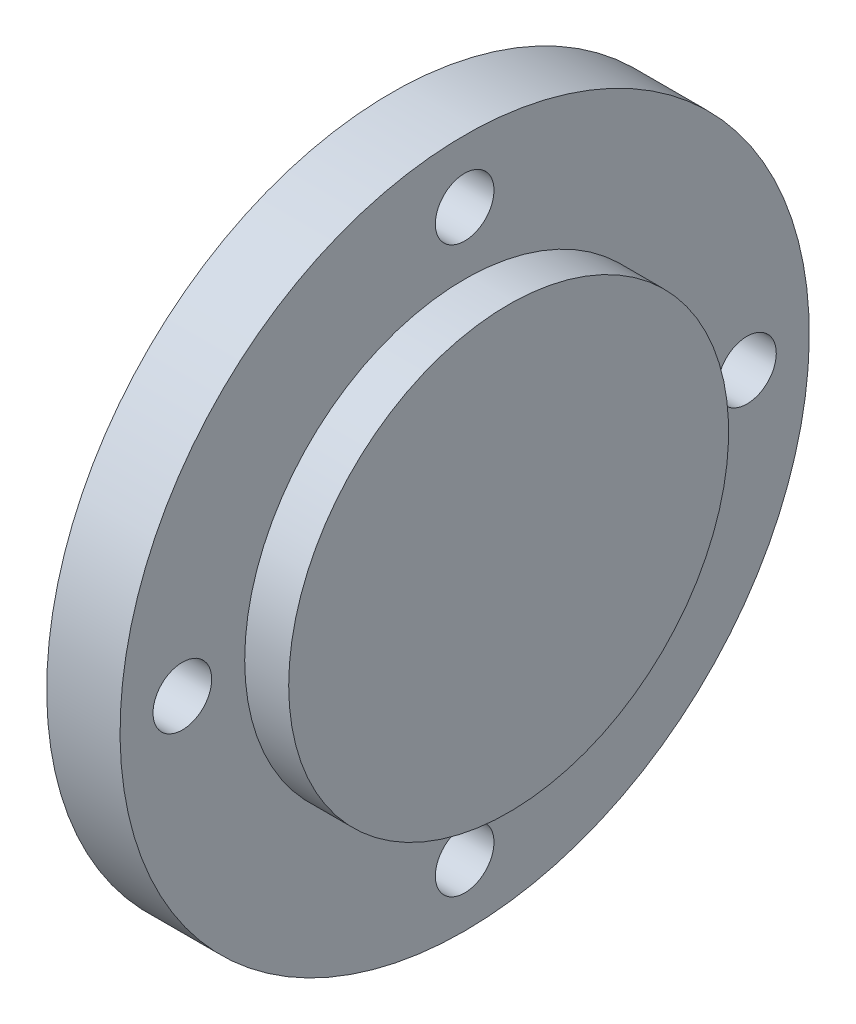
ISO-10303-21;
HEADER;
FILE_DESCRIPTION(('STEP AP214'),'2;1');
FILE_NAME('part.step','',(''),(''),'','','');
FILE_SCHEMA(('AUTOMOTIVE_DESIGN { 1 0 10303 214 1 1 1 1 }'));
ENDSEC;
DATA;
#1=APPLICATION_CONTEXT('core data for automotive mechanical design processes');
#2=APPLICATION_PROTOCOL_DEFINITION('international standard','automotive_design',2000,#1);
#3=PRODUCT_CONTEXT('',#1,'mechanical');
#4=PRODUCT('Part','Part','',(#3));
#5=PRODUCT_RELATED_PRODUCT_CATEGORY('part','',(#4));
#6=PRODUCT_DEFINITION_FORMATION('','',#4);
#7=PRODUCT_DEFINITION_CONTEXT('part definition',#1,'design');
#8=PRODUCT_DEFINITION('design','',#6,#7);
#9=PRODUCT_DEFINITION_SHAPE('','',#8);
#10=(LENGTH_UNIT() NAMED_UNIT(*) SI_UNIT(.MILLI.,.METRE.));
#11=(NAMED_UNIT(*) PLANE_ANGLE_UNIT() SI_UNIT($,.RADIAN.));
#12=(NAMED_UNIT(*) SI_UNIT($,.STERADIAN.) SOLID_ANGLE_UNIT());
#13=UNCERTAINTY_MEASURE_WITH_UNIT(LENGTH_MEASURE(1.E-05),#10,'distance_accuracy_value','');
#14=(GEOMETRIC_REPRESENTATION_CONTEXT(3) GLOBAL_UNCERTAINTY_ASSIGNED_CONTEXT((#13)) GLOBAL_UNIT_ASSIGNED_CONTEXT((#10,
#11,#12)) REPRESENTATION_CONTEXT('',''));
#15=CARTESIAN_POINT('',(0.,0.,0.));
#16=DIRECTION('',(0.,0.,1.));
#17=DIRECTION('',(1.,0.,0.));
#18=AXIS2_PLACEMENT_3D('',#15,#16,#17);
#19=CARTESIAN_POINT('',(-1.,0.,0.));
#20=DIRECTION('',(1.,0.,0.));
#21=DIRECTION('',(0.,1.,0.));
#22=AXIS2_PLACEMENT_3D('',#19,#20,#21);
#23=PLANE('',#22);
#24=CARTESIAN_POINT('',(-1.,0.,0.));
#25=DIRECTION('',(1.,0.,0.));
#26=DIRECTION('',(0.,-1.,0.));
#27=AXIS2_PLACEMENT_3D('',#24,#25,#26);
#28=CIRCLE('',#27,7.55);
#29=CARTESIAN_POINT('',(-1.,7.55,0.));
#30=VERTEX_POINT('',#29);
#31=EDGE_CURVE('E180',#30,#30,#28,.T.);
#32=ORIENTED_EDGE('',*,*,#31,.T.);
#33=EDGE_LOOP('',(#32));
#34=FACE_BOUND('',#33,.T.);
#35=CARTESIAN_POINT('',(-1.,0.,0.));
#36=DIRECTION('',(-1.,0.,0.));
#37=DIRECTION('',(0.,0.,-1.));
#38=AXIS2_PLACEMENT_3D('',#35,#36,#37);
#39=CIRCLE('',#38,14.);
#40=CARTESIAN_POINT('',(-1.,0.,14.));
#41=VERTEX_POINT('',#40);
#42=EDGE_CURVE('E181',#41,#41,#39,.T.);
#43=ORIENTED_EDGE('',*,*,#42,.T.);
#44=EDGE_LOOP('',(#43));
#45=FACE_BOUND('',#44,.T.);
#46=ADVANCED_FACE('F17',(#34,#45),#23,.F.);
#47=CARTESIAN_POINT('',(0.,0.,0.));
#48=DIRECTION('',(1.,0.,0.));
#49=DIRECTION('',(0.,1.,0.));
#50=AXIS2_PLACEMENT_3D('',#47,#48,#49);
#51=PLANE('',#50);
#52=CARTESIAN_POINT('',(0.,0.,0.));
#53=DIRECTION('',(-1.,0.,0.));
#54=DIRECTION('',(0.,-1.,0.));
#55=AXIS2_PLACEMENT_3D('',#52,#53,#54);
#56=CIRCLE('',#55,7.55);
#57=CARTESIAN_POINT('',(0.,7.55,0.));
#58=VERTEX_POINT('',#57);
#59=EDGE_CURVE('E40',#58,#58,#56,.T.);
#60=ORIENTED_EDGE('',*,*,#59,.T.);
#61=EDGE_LOOP('',(#60));
#62=FACE_BOUND('',#61,.T.);
#63=CARTESIAN_POINT('',(0.,0.,0.));
#64=DIRECTION('',(1.,0.,0.));
#65=DIRECTION('',(0.,-1.,0.));
#66=AXIS2_PLACEMENT_3D('',#63,#64,#65);
#67=CIRCLE('',#66,10.5);
#68=CARTESIAN_POINT('',(0.,10.5,0.));
#69=VERTEX_POINT('',#68);
#70=EDGE_CURVE('E171',#69,#69,#67,.T.);
#71=ORIENTED_EDGE('',*,*,#70,.T.);
#72=EDGE_LOOP('',(#71));
#73=FACE_BOUND('',#72,.T.);
#74=ADVANCED_FACE('F270',(#62,#73),#51,.T.);
#75=CARTESIAN_POINT('',(0.,0.,0.));
#76=DIRECTION('',(-1.,0.,0.));
#77=DIRECTION('',(0.,1.,0.));
#78=AXIS2_PLACEMENT_3D('',#75,#76,#77);
#79=CYLINDRICAL_SURFACE('',#78,23.5);
#80=CARTESIAN_POINT('',(-2.,0.,0.));
#81=DIRECTION('',(-1.,0.,0.));
#82=DIRECTION('',(0.,0.,1.));
#83=AXIS2_PLACEMENT_3D('',#80,#81,#82);
#84=CIRCLE('',#83,23.5);
#85=CARTESIAN_POINT('',(-2.,-23.5,0.));
#86=VERTEX_POINT('',#85);
#87=EDGE_CURVE('E154',#86,#86,#84,.T.);
#88=ORIENTED_EDGE('',*,*,#87,.F.);
#89=DIRECTION('',(1.,0.,0.));
#90=VECTOR('',#89,1.);
#91=CARTESIAN_POINT('',(0.,-23.5,0.));
#92=LINE('',#91,#90);
#93=CARTESIAN_POINT('',(3.,-23.5,0.));
#94=VERTEX_POINT('',#93);
#95=EDGE_CURVE('E11',#86,#94,#92,.T.);
#96=ORIENTED_EDGE('',*,*,#95,.T.);
#97=CARTESIAN_POINT('',(3.,0.,0.));
#98=DIRECTION('',(1.,0.,0.));
#99=DIRECTION('',(0.,1.,0.));
#100=AXIS2_PLACEMENT_3D('',#97,#98,#99);
#101=CIRCLE('',#100,23.5);
#102=EDGE_CURVE('E163',#94,#94,#101,.T.);
#103=ORIENTED_EDGE('',*,*,#102,.F.);
#104=ORIENTED_EDGE('',*,*,#95,.F.);
#105=EDGE_LOOP('',(#88,#96,#103,#104));
#106=FACE_BOUND('',#105,.T.);
#107=ADVANCED_FACE('F251',(#106),#79,.T.);
#108=CARTESIAN_POINT('',(0.,0.,-19.25));
#109=DIRECTION('',(-1.,0.,0.));
#110=DIRECTION('',(0.,-1.,0.));
#111=AXIS2_PLACEMENT_3D('',#108,#109,#110);
#112=CYLINDRICAL_SURFACE('',#111,2.);
#113=CARTESIAN_POINT('',(-2.,0.,-19.25));
#114=DIRECTION('',(1.,0.,0.));
#115=DIRECTION('',(0.,0.,1.));
#116=AXIS2_PLACEMENT_3D('',#113,#114,#115);
#117=CIRCLE('',#116,2.);
#118=CARTESIAN_POINT('',(-2.,2.,-19.25));
#119=VERTEX_POINT('',#118);
#120=EDGE_CURVE('E143',#119,#119,#117,.T.);
#121=ORIENTED_EDGE('',*,*,#120,.F.);
#122=DIRECTION('',(1.,0.,0.));
#123=VECTOR('',#122,1.);
#124=CARTESIAN_POINT('',(0.,2.,-19.25));
#125=LINE('',#124,#123);
#126=CARTESIAN_POINT('',(3.,2.,-19.25));
#127=VERTEX_POINT('',#126);
#128=EDGE_CURVE('E28',#119,#127,#125,.T.);
#129=ORIENTED_EDGE('',*,*,#128,.T.);
#130=CARTESIAN_POINT('',(3.,0.,-19.25));
#131=DIRECTION('',(-1.,0.,0.));
#132=DIRECTION('',(0.,-1.,0.));
#133=AXIS2_PLACEMENT_3D('',#130,#131,#132);
#134=CIRCLE('',#133,2.);
#135=EDGE_CURVE('E158',#127,#127,#134,.T.);
#136=ORIENTED_EDGE('',*,*,#135,.F.);
#137=ORIENTED_EDGE('',*,*,#128,.F.);
#138=EDGE_LOOP('',(#121,#129,#136,#137));
#139=FACE_BOUND('',#138,.T.);
#140=ADVANCED_FACE('F19',(#139),#112,.F.);
#141=CARTESIAN_POINT('',(0.,19.25,0.));
#142=DIRECTION('',(-1.,0.,0.));
#143=DIRECTION('',(0.,-1.,0.));
#144=AXIS2_PLACEMENT_3D('',#141,#142,#143);
#145=CYLINDRICAL_SURFACE('',#144,2.);
#146=CARTESIAN_POINT('',(-2.,19.25,0.));
#147=DIRECTION('',(1.,0.,0.));
#148=DIRECTION('',(0.,0.,1.));
#149=AXIS2_PLACEMENT_3D('',#146,#147,#148);
#150=CIRCLE('',#149,2.);
#151=CARTESIAN_POINT('',(-2.,21.25,0.));
#152=VERTEX_POINT('',#151);
#153=EDGE_CURVE('E151',#152,#152,#150,.T.);
#154=ORIENTED_EDGE('',*,*,#153,.F.);
#155=DIRECTION('',(1.,0.,0.));
#156=VECTOR('',#155,1.);
#157=CARTESIAN_POINT('',(0.,21.25,0.));
#158=LINE('',#157,#156);
#159=CARTESIAN_POINT('',(3.,21.25,0.));
#160=VERTEX_POINT('',#159);
#161=EDGE_CURVE('E136',#152,#160,#158,.T.);
#162=ORIENTED_EDGE('',*,*,#161,.T.);
#163=CARTESIAN_POINT('',(3.,19.25,0.));
#164=DIRECTION('',(-1.,0.,0.));
#165=DIRECTION('',(0.,-1.,0.));
#166=AXIS2_PLACEMENT_3D('',#163,#164,#165);
#167=CIRCLE('',#166,2.);
#168=EDGE_CURVE('E162',#160,#160,#167,.T.);
#169=ORIENTED_EDGE('',*,*,#168,.F.);
#170=ORIENTED_EDGE('',*,*,#161,.F.);
#171=EDGE_LOOP('',(#154,#162,#169,#170));
#172=FACE_BOUND('',#171,.T.);
#173=ADVANCED_FACE('F281',(#172),#145,.F.);
#174=CARTESIAN_POINT('',(0.,0.,19.25));
#175=DIRECTION('',(-1.,0.,0.));
#176=DIRECTION('',(0.,-1.,0.));
#177=AXIS2_PLACEMENT_3D('',#174,#175,#176);
#178=CYLINDRICAL_SURFACE('',#177,2.);
#179=CARTESIAN_POINT('',(-2.,0.,19.25));
#180=DIRECTION('',(1.,0.,0.));
#181=DIRECTION('',(0.,0.,1.));
#182=AXIS2_PLACEMENT_3D('',#179,#180,#181);
#183=CIRCLE('',#182,2.);
#184=CARTESIAN_POINT('',(-2.,2.,19.25));
#185=VERTEX_POINT('',#184);
#186=EDGE_CURVE('E132',#185,#185,#183,.T.);
#187=ORIENTED_EDGE('',*,*,#186,.F.);
#188=DIRECTION('',(1.,0.,0.));
#189=VECTOR('',#188,1.);
#190=CARTESIAN_POINT('',(0.,2.,19.25));
#191=LINE('',#190,#189);
#192=CARTESIAN_POINT('',(3.,2.,19.25));
#193=VERTEX_POINT('',#192);
#194=EDGE_CURVE('E129',#185,#193,#191,.T.);
#195=ORIENTED_EDGE('',*,*,#194,.T.);
#196=CARTESIAN_POINT('',(3.,0.,19.25));
#197=DIRECTION('',(-1.,0.,0.));
#198=DIRECTION('',(0.,-1.,0.));
#199=AXIS2_PLACEMENT_3D('',#196,#197,#198);
#200=CIRCLE('',#199,2.);
#201=EDGE_CURVE('E134',#193,#193,#200,.T.);
#202=ORIENTED_EDGE('',*,*,#201,.F.);
#203=ORIENTED_EDGE('',*,*,#194,.F.);
#204=EDGE_LOOP('',(#187,#195,#202,#203));
#205=FACE_BOUND('',#204,.T.);
#206=ADVANCED_FACE('F131',(#205),#178,.F.);
#207=CARTESIAN_POINT('',(0.,-19.25,0.));
#208=DIRECTION('',(-1.,0.,0.));
#209=DIRECTION('',(0.,-1.,0.));
#210=AXIS2_PLACEMENT_3D('',#207,#208,#209);
#211=CYLINDRICAL_SURFACE('',#210,2.);
#212=CARTESIAN_POINT('',(-2.,-19.25,0.));
#213=DIRECTION('',(1.,0.,0.));
#214=DIRECTION('',(0.,0.,1.));
#215=AXIS2_PLACEMENT_3D('',#212,#213,#214);
#216=CIRCLE('',#215,2.);
#217=CARTESIAN_POINT('',(-2.,-17.25,0.));
#218=VERTEX_POINT('',#217);
#219=EDGE_CURVE('E144',#218,#218,#216,.T.);
#220=ORIENTED_EDGE('',*,*,#219,.F.);
#221=DIRECTION('',(1.,0.,0.));
#222=VECTOR('',#221,1.);
#223=CARTESIAN_POINT('',(0.,-17.25,0.));
#224=LINE('',#223,#222);
#225=CARTESIAN_POINT('',(3.,-17.25,0.));
#226=VERTEX_POINT('',#225);
#227=EDGE_CURVE('E137',#218,#226,#224,.T.);
#228=ORIENTED_EDGE('',*,*,#227,.T.);
#229=CARTESIAN_POINT('',(3.,-19.25,0.));
#230=DIRECTION('',(-1.,0.,0.));
#231=DIRECTION('',(0.,-1.,0.));
#232=AXIS2_PLACEMENT_3D('',#229,#230,#231);
#233=CIRCLE('',#232,2.);
#234=EDGE_CURVE('E174',#226,#226,#233,.T.);
#235=ORIENTED_EDGE('',*,*,#234,.F.);
#236=ORIENTED_EDGE('',*,*,#227,.F.);
#237=EDGE_LOOP('',(#220,#228,#235,#236));
#238=FACE_BOUND('',#237,.T.);
#239=ADVANCED_FACE('F234',(#238),#211,.F.);
#240=CARTESIAN_POINT('',(0.,0.,0.));
#241=DIRECTION('',(-1.,0.,0.));
#242=DIRECTION('',(0.,-1.,0.));
#243=AXIS2_PLACEMENT_3D('',#240,#241,#242);
#244=CYLINDRICAL_SURFACE('',#243,7.55);
#245=ORIENTED_EDGE('',*,*,#31,.F.);
#246=DIRECTION('',(1.,0.,0.));
#247=VECTOR('',#246,1.);
#248=CARTESIAN_POINT('',(0.,7.55,0.));
#249=LINE('',#248,#247);
#250=EDGE_CURVE('E196',#30,#58,#249,.T.);
#251=ORIENTED_EDGE('',*,*,#250,.T.);
#252=ORIENTED_EDGE('',*,*,#59,.F.);
#253=ORIENTED_EDGE('',*,*,#250,.F.);
#254=EDGE_LOOP('',(#245,#251,#252,#253));
#255=FACE_BOUND('',#254,.T.);
#256=ADVANCED_FACE('F240',(#255),#244,.F.);
#257=CARTESIAN_POINT('',(3.,0.,0.));
#258=DIRECTION('',(1.,0.,0.));
#259=DIRECTION('',(0.,1.,0.));
#260=AXIS2_PLACEMENT_3D('',#257,#258,#259);
#261=PLANE('',#260);
#262=ORIENTED_EDGE('',*,*,#234,.T.);
#263=EDGE_LOOP('',(#262));
#264=FACE_BOUND('',#263,.T.);
#265=ORIENTED_EDGE('',*,*,#201,.T.);
#266=EDGE_LOOP('',(#265));
#267=FACE_BOUND('',#266,.T.);
#268=ORIENTED_EDGE('',*,*,#168,.T.);
#269=EDGE_LOOP('',(#268));
#270=FACE_BOUND('',#269,.T.);
#271=ORIENTED_EDGE('',*,*,#135,.T.);
#272=EDGE_LOOP('',(#271));
#273=FACE_BOUND('',#272,.T.);
#274=CARTESIAN_POINT('',(3.,0.,0.));
#275=DIRECTION('',(-1.,0.,0.));
#276=DIRECTION('',(0.,0.,-1.));
#277=AXIS2_PLACEMENT_3D('',#274,#275,#276);
#278=CIRCLE('',#277,15.);
#279=CARTESIAN_POINT('',(3.,0.,15.));
#280=VERTEX_POINT('',#279);
#281=EDGE_CURVE('E204',#280,#280,#278,.T.);
#282=ORIENTED_EDGE('',*,*,#281,.T.);
#283=EDGE_LOOP('',(#282));
#284=FACE_BOUND('',#283,.T.);
#285=ORIENTED_EDGE('',*,*,#102,.T.);
#286=EDGE_LOOP('',(#285));
#287=FACE_BOUND('',#286,.T.);
#288=ADVANCED_FACE('F236',(#264,#267,#270,#273,#284,#287),#261,.T.);
#289=CARTESIAN_POINT('',(0.,0.,0.));
#290=DIRECTION('',(1.,0.,0.));
#291=DIRECTION('',(0.,-1.,0.));
#292=AXIS2_PLACEMENT_3D('',#289,#290,#291);
#293=CYLINDRICAL_SURFACE('',#292,10.5);
#294=CARTESIAN_POINT('',(3.,0.,0.));
#295=DIRECTION('',(-1.,0.,0.));
#296=DIRECTION('',(0.,-1.,0.));
#297=AXIS2_PLACEMENT_3D('',#294,#295,#296);
#298=CIRCLE('',#297,10.5);
#299=CARTESIAN_POINT('',(3.,10.5,0.));
#300=VERTEX_POINT('',#299);
#301=EDGE_CURVE('E164',#300,#300,#298,.T.);
#302=ORIENTED_EDGE('',*,*,#301,.F.);
#303=DIRECTION('',(-1.,0.,0.));
#304=VECTOR('',#303,1.);
#305=CARTESIAN_POINT('',(0.,10.5,0.));
#306=LINE('',#305,#304);
#307=EDGE_CURVE('E106',#300,#69,#306,.T.);
#308=ORIENTED_EDGE('',*,*,#307,.T.);
#309=ORIENTED_EDGE('',*,*,#70,.F.);
#310=ORIENTED_EDGE('',*,*,#307,.F.);
#311=EDGE_LOOP('',(#302,#308,#309,#310));
#312=FACE_BOUND('',#311,.T.);
#313=ADVANCED_FACE('F239',(#312),#293,.F.);
#314=CARTESIAN_POINT('',(-2.,0.,0.));
#315=DIRECTION('',(-1.,0.,0.));
#316=DIRECTION('',(0.,0.,1.));
#317=AXIS2_PLACEMENT_3D('',#314,#315,#316);
#318=PLANE('',#317);
#319=CARTESIAN_POINT('',(-2.,0.,0.));
#320=DIRECTION('',(1.,0.,0.));
#321=DIRECTION('',(0.,0.,1.));
#322=AXIS2_PLACEMENT_3D('',#319,#320,#321);
#323=CIRCLE('',#322,16.);
#324=CARTESIAN_POINT('',(-2.,0.,-16.));
#325=VERTEX_POINT('',#324);
#326=EDGE_CURVE('E191',#325,#325,#323,.T.);
#327=ORIENTED_EDGE('',*,*,#326,.T.);
#328=EDGE_LOOP('',(#327));
#329=FACE_BOUND('',#328,.T.);
#330=ORIENTED_EDGE('',*,*,#153,.T.);
#331=EDGE_LOOP('',(#330));
#332=FACE_BOUND('',#331,.T.);
#333=ORIENTED_EDGE('',*,*,#120,.T.);
#334=EDGE_LOOP('',(#333));
#335=FACE_BOUND('',#334,.T.);
#336=ORIENTED_EDGE('',*,*,#186,.T.);
#337=EDGE_LOOP('',(#336));
#338=FACE_BOUND('',#337,.T.);
#339=ORIENTED_EDGE('',*,*,#219,.T.);
#340=EDGE_LOOP('',(#339));
#341=FACE_BOUND('',#340,.T.);
#342=ORIENTED_EDGE('',*,*,#87,.T.);
#343=EDGE_LOOP('',(#342));
#344=FACE_BOUND('',#343,.T.);
#345=ADVANCED_FACE('F140',(#329,#332,#335,#338,#341,#344),#318,.T.);
#346=CARTESIAN_POINT('',(-1.,0.,0.));
#347=DIRECTION('',(-1.,0.,0.));
#348=DIRECTION('',(0.,0.,-1.));
#349=AXIS2_PLACEMENT_3D('',#346,#347,#348);
#350=CYLINDRICAL_SURFACE('',#349,14.);
#351=CARTESIAN_POINT('',(-3.,0.,0.));
#352=DIRECTION('',(1.,0.,0.));
#353=DIRECTION('',(0.,0.,-1.));
#354=AXIS2_PLACEMENT_3D('',#351,#352,#353);
#355=CIRCLE('',#354,14.);
#356=CARTESIAN_POINT('',(-3.,0.,14.));
#357=VERTEX_POINT('',#356);
#358=EDGE_CURVE('E21',#357,#357,#355,.T.);
#359=ORIENTED_EDGE('',*,*,#358,.F.);
#360=DIRECTION('',(1.,0.,0.));
#361=VECTOR('',#360,1.);
#362=CARTESIAN_POINT('',(-1.,0.,14.));
#363=LINE('',#362,#361);
#364=EDGE_CURVE('E184',#357,#41,#363,.T.);
#365=ORIENTED_EDGE('',*,*,#364,.T.);
#366=ORIENTED_EDGE('',*,*,#42,.F.);
#367=ORIENTED_EDGE('',*,*,#364,.F.);
#368=EDGE_LOOP('',(#359,#365,#366,#367));
#369=FACE_BOUND('',#368,.T.);
#370=ADVANCED_FACE('F254',(#369),#350,.F.);
#371=CARTESIAN_POINT('',(-3.,0.,0.));
#372=DIRECTION('',(-1.,0.,0.));
#373=DIRECTION('',(0.,0.,1.));
#374=AXIS2_PLACEMENT_3D('',#371,#372,#373);
#375=PLANE('',#374);
#376=ORIENTED_EDGE('',*,*,#358,.T.);
#377=EDGE_LOOP('',(#376));
#378=FACE_BOUND('',#377,.T.);
#379=CARTESIAN_POINT('',(-3.,0.,0.));
#380=DIRECTION('',(-1.,0.,0.));
#381=DIRECTION('',(0.,0.,1.));
#382=AXIS2_PLACEMENT_3D('',#379,#380,#381);
#383=CIRCLE('',#382,16.);
#384=CARTESIAN_POINT('',(-3.,0.,-16.));
#385=VERTEX_POINT('',#384);
#386=EDGE_CURVE('E192',#385,#385,#383,.T.);
#387=ORIENTED_EDGE('',*,*,#386,.T.);
#388=EDGE_LOOP('',(#387));
#389=FACE_BOUND('',#388,.T.);
#390=ADVANCED_FACE('F263',(#378,#389),#375,.T.);
#391=CARTESIAN_POINT('',(-2.,0.,0.));
#392=DIRECTION('',(-1.,0.,0.));
#393=DIRECTION('',(0.,0.,1.));
#394=AXIS2_PLACEMENT_3D('',#391,#392,#393);
#395=CYLINDRICAL_SURFACE('',#394,16.);
#396=ORIENTED_EDGE('',*,*,#386,.F.);
#397=DIRECTION('',(1.,0.,0.));
#398=VECTOR('',#397,1.);
#399=CARTESIAN_POINT('',(-2.,0.,-16.));
#400=LINE('',#399,#398);
#401=EDGE_CURVE('E188',#385,#325,#400,.T.);
#402=ORIENTED_EDGE('',*,*,#401,.T.);
#403=ORIENTED_EDGE('',*,*,#326,.F.);
#404=ORIENTED_EDGE('',*,*,#401,.F.);
#405=EDGE_LOOP('',(#396,#402,#403,#404));
#406=FACE_BOUND('',#405,.T.);
#407=ADVANCED_FACE('F285',(#406),#395,.T.);
#408=CARTESIAN_POINT('',(6.,0.,0.));
#409=DIRECTION('',(1.,0.,0.));
#410=DIRECTION('',(0.,1.,0.));
#411=AXIS2_PLACEMENT_3D('',#408,#409,#410);
#412=PLANE('',#411);
#413=CARTESIAN_POINT('',(6.,0.,0.));
#414=DIRECTION('',(1.,0.,0.));
#415=DIRECTION('',(0.,0.,-1.));
#416=AXIS2_PLACEMENT_3D('',#413,#414,#415);
#417=CIRCLE('',#416,15.);
#418=CARTESIAN_POINT('',(6.,0.,15.));
#419=VERTEX_POINT('',#418);
#420=EDGE_CURVE('E167',#419,#419,#417,.T.);
#421=ORIENTED_EDGE('',*,*,#420,.T.);
#422=EDGE_LOOP('',(#421));
#423=FACE_BOUND('',#422,.T.);
#424=ADVANCED_FACE('F296',(#423),#412,.T.);
#425=CARTESIAN_POINT('',(3.,0.,0.));
#426=DIRECTION('',(1.,0.,0.));
#427=DIRECTION('',(0.,0.,-1.));
#428=AXIS2_PLACEMENT_3D('',#425,#426,#427);
#429=CYLINDRICAL_SURFACE('',#428,15.);
#430=ORIENTED_EDGE('',*,*,#420,.F.);
#431=DIRECTION('',(-1.,0.,0.));
#432=VECTOR('',#431,1.);
#433=CARTESIAN_POINT('',(3.,0.,15.));
#434=LINE('',#433,#432);
#435=EDGE_CURVE('E94',#419,#280,#434,.T.);
#436=ORIENTED_EDGE('',*,*,#435,.T.);
#437=ORIENTED_EDGE('',*,*,#281,.F.);
#438=ORIENTED_EDGE('',*,*,#435,.F.);
#439=EDGE_LOOP('',(#430,#436,#437,#438));
#440=FACE_BOUND('',#439,.T.);
#441=ADVANCED_FACE('F290',(#440),#429,.T.);
#442=CARTESIAN_POINT('',(3.,0.,0.));
#443=DIRECTION('',(1.,0.,0.));
#444=DIRECTION('',(0.,1.,0.));
#445=AXIS2_PLACEMENT_3D('',#442,#443,#444);
#446=PLANE('',#445);
#447=ORIENTED_EDGE('',*,*,#301,.T.);
#448=EDGE_LOOP('',(#447));
#449=FACE_BOUND('',#448,.T.);
#450=ADVANCED_FACE('F288',(#449),#446,.F.);
#451=CLOSED_SHELL('',(#46,#74,#107,#140,#173,#206,#239,#256,#288,#313,#345,#370,#390,#407,#424,
#441,#450));
#452=MANIFOLD_SOLID_BREP('B1',#451);
#453=ADVANCED_BREP_SHAPE_REPRESENTATION('',(#18,#452),#14);
#454=SHAPE_DEFINITION_REPRESENTATION(#9,#453);
ENDSEC;
END-ISO-10303-21;
